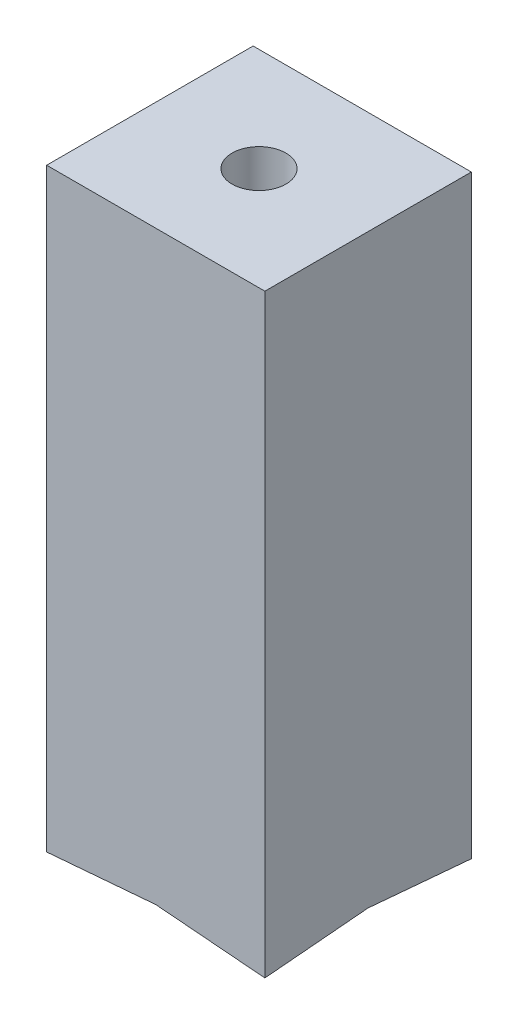
ISO-10303-21;
HEADER;
FILE_DESCRIPTION(('STEP AP214'),'2;1');
FILE_NAME('part.step','',(''),(''),'','','');
FILE_SCHEMA(('AUTOMOTIVE_DESIGN { 1 0 10303 214 1 1 1 1 }'));
ENDSEC;
DATA;
#1=APPLICATION_CONTEXT('core data for automotive mechanical design processes');
#2=APPLICATION_PROTOCOL_DEFINITION('international standard','automotive_design',2000,#1);
#3=PRODUCT_CONTEXT('',#1,'mechanical');
#4=PRODUCT('Part','Part','',(#3));
#5=PRODUCT_RELATED_PRODUCT_CATEGORY('part','',(#4));
#6=PRODUCT_DEFINITION_FORMATION('','',#4);
#7=PRODUCT_DEFINITION_CONTEXT('part definition',#1,'design');
#8=PRODUCT_DEFINITION('design','',#6,#7);
#9=PRODUCT_DEFINITION_SHAPE('','',#8);
#10=(LENGTH_UNIT() NAMED_UNIT(*) SI_UNIT(.MILLI.,.METRE.));
#11=(NAMED_UNIT(*) PLANE_ANGLE_UNIT() SI_UNIT($,.RADIAN.));
#12=(NAMED_UNIT(*) SI_UNIT($,.STERADIAN.) SOLID_ANGLE_UNIT());
#13=UNCERTAINTY_MEASURE_WITH_UNIT(LENGTH_MEASURE(1.E-05),#10,'distance_accuracy_value','');
#14=(GEOMETRIC_REPRESENTATION_CONTEXT(3) GLOBAL_UNCERTAINTY_ASSIGNED_CONTEXT((#13)) GLOBAL_UNIT_ASSIGNED_CONTEXT((#10,
#11,#12)) REPRESENTATION_CONTEXT('',''));
#15=CARTESIAN_POINT('',(0.,0.,0.));
#16=DIRECTION('',(0.,0.,1.));
#17=DIRECTION('',(1.,0.,0.));
#18=AXIS2_PLACEMENT_3D('',#15,#16,#17);
#19=CARTESIAN_POINT('',(-10.125,-55.2,9.58));
#20=DIRECTION('',(0.,0.996194698091746,0.0871557427476512));
#21=DIRECTION('',(0.,-0.0871557427476512,0.996194698091746));
#22=AXIS2_PLACEMENT_3D('',#19,#20,#21);
#23=PLANE('',#22);
#24=DIRECTION('',(1.,0.,0.));
#25=VECTOR('',#24,1.);
#26=CARTESIAN_POINT('',(-10.125,-54.3618586034217,0.));
#27=LINE('',#26,#25);
#28=CARTESIAN_POINT('',(-10.125,-54.3618586034217,0.));
#29=VERTEX_POINT('',#28);
#30=CARTESIAN_POINT('',(0.,-54.3618586034217,0.));
#31=VERTEX_POINT('',#30);
#32=EDGE_CURVE('E160',#29,#31,#27,.T.);
#33=ORIENTED_EDGE('',*,*,#32,.T.);
#34=DIRECTION('',(-0.725076524318788,-0.0600213976018447,0.686047713873974));
#35=VECTOR('',#34,1.);
#36=CARTESIAN_POINT('',(-10.125,-55.2,9.58));
#37=LINE('',#36,#35);
#38=CARTESIAN_POINT('',(-10.125,-55.2,9.58));
#39=VERTEX_POINT('',#38);
#40=EDGE_CURVE('E145',#31,#39,#37,.T.);
#41=ORIENTED_EDGE('',*,*,#40,.T.);
#42=DIRECTION('',(0.,-0.0871557427476512,0.996194698091746));
#43=VECTOR('',#42,1.);
#44=CARTESIAN_POINT('',(-10.125,-55.2,9.58));
#45=LINE('',#44,#43);
#46=EDGE_CURVE('E152',#29,#39,#45,.T.);
#47=ORIENTED_EDGE('',*,*,#46,.F.);
#48=EDGE_LOOP('',(#33,#41,#47));
#49=FACE_BOUND('',#48,.T.);
#50=ADVANCED_FACE('F51',(#49),#23,.F.);
#51=CARTESIAN_POINT('',(-10.125,-54.3618586034217,0.));
#52=DIRECTION('',(0.,0.996194698091746,-0.0871557427476512));
#53=DIRECTION('',(0.,0.0871557427476512,0.996194698091746));
#54=AXIS2_PLACEMENT_3D('',#51,#52,#53);
#55=PLANE('',#54);
#56=DIRECTION('',(0.,0.0871557427476512,0.996194698091746));
#57=VECTOR('',#56,1.);
#58=CARTESIAN_POINT('',(-10.125,-54.3618586034217,0.));
#59=LINE('',#58,#57);
#60=CARTESIAN_POINT('',(-10.125,-55.2,-9.58));
#61=VERTEX_POINT('',#60);
#62=EDGE_CURVE('E149',#61,#29,#59,.T.);
#63=ORIENTED_EDGE('',*,*,#62,.F.);
#64=DIRECTION('',(0.725076524318788,0.0600213976018447,0.686047713873974));
#65=VECTOR('',#64,1.);
#66=CARTESIAN_POINT('',(-5.32307665694692,-54.8024996802955,-5.03655055541249));
#67=LINE('',#66,#65);
#68=EDGE_CURVE('E11',#61,#31,#67,.T.);
#69=ORIENTED_EDGE('',*,*,#68,.T.);
#70=ORIENTED_EDGE('',*,*,#32,.F.);
#71=EDGE_LOOP('',(#63,#69,#70));
#72=FACE_BOUND('',#71,.T.);
#73=ADVANCED_FACE('F205',(#72),#55,.F.);
#74=CARTESIAN_POINT('',(10.125,-55.2,9.58));
#75=DIRECTION('',(1.,0.,0.));
#76=DIRECTION('',(0.,0.,-1.));
#77=AXIS2_PLACEMENT_3D('',#74,#75,#76);
#78=PLANE('',#77);
#79=DIRECTION('',(0.,-0.0871557427476512,0.996194698091746));
#80=VECTOR('',#79,1.);
#81=CARTESIAN_POINT('',(10.125,-55.2,9.58));
#82=LINE('',#81,#80);
#83=CARTESIAN_POINT('',(10.125,-54.3618586034217,0.));
#84=VERTEX_POINT('',#83);
#85=CARTESIAN_POINT('',(10.125,-55.2,9.58));
#86=VERTEX_POINT('',#85);
#87=EDGE_CURVE('E153',#84,#86,#82,.T.);
#88=ORIENTED_EDGE('',*,*,#87,.F.);
#89=DIRECTION('',(0.,0.0871557427476512,0.996194698091746));
#90=VECTOR('',#89,1.);
#91=CARTESIAN_POINT('',(10.125,-54.3618586034217,0.));
#92=LINE('',#91,#90);
#93=CARTESIAN_POINT('',(10.125,-55.2,-9.58));
#94=VERTEX_POINT('',#93);
#95=EDGE_CURVE('E148',#94,#84,#92,.T.);
#96=ORIENTED_EDGE('',*,*,#95,.F.);
#97=DIRECTION('',(0.,1.,0.));
#98=VECTOR('',#97,1.);
#99=CARTESIAN_POINT('',(10.125,-55.2,-9.58));
#100=LINE('',#99,#98);
#101=CARTESIAN_POINT('',(10.125,0.,-9.58));
#102=VERTEX_POINT('',#101);
#103=EDGE_CURVE('E174',#94,#102,#100,.T.);
#104=ORIENTED_EDGE('',*,*,#103,.T.);
#105=DIRECTION('',(0.,0.,-1.));
#106=VECTOR('',#105,1.);
#107=CARTESIAN_POINT('',(10.125,0.,9.58));
#108=LINE('',#107,#106);
#109=CARTESIAN_POINT('',(10.125,0.,9.58));
#110=VERTEX_POINT('',#109);
#111=EDGE_CURVE('E163',#110,#102,#108,.T.);
#112=ORIENTED_EDGE('',*,*,#111,.F.);
#113=DIRECTION('',(0.,1.,0.));
#114=VECTOR('',#113,1.);
#115=CARTESIAN_POINT('',(10.125,-55.2,9.58));
#116=LINE('',#115,#114);
#117=EDGE_CURVE('E66',#86,#110,#116,.T.);
#118=ORIENTED_EDGE('',*,*,#117,.F.);
#119=EDGE_LOOP('',(#88,#96,#104,#112,#118));
#120=FACE_BOUND('',#119,.T.);
#121=ADVANCED_FACE('F53',(#120),#78,.T.);
#122=CARTESIAN_POINT('',(-10.125,-55.2,9.58));
#123=DIRECTION('',(0.,0.,1.));
#124=DIRECTION('',(1.,0.,0.));
#125=AXIS2_PLACEMENT_3D('',#122,#123,#124);
#126=PLANE('',#125);
#127=DIRECTION('',(-0.996591294165675,-0.0824972265787436,0.));
#128=VECTOR('',#127,1.);
#129=CARTESIAN_POINT('',(-10.125,-55.2,9.58));
#130=LINE('',#129,#128);
#131=CARTESIAN_POINT('',(0.,-54.3618586034217,9.58));
#132=VERTEX_POINT('',#131);
#133=EDGE_CURVE('E126',#132,#39,#130,.T.);
#134=ORIENTED_EDGE('',*,*,#133,.F.);
#135=DIRECTION('',(-0.996591294165675,0.0824972265787436,0.));
#136=VECTOR('',#135,1.);
#137=CARTESIAN_POINT('',(0.,-54.3618586034217,9.58));
#138=LINE('',#137,#136);
#139=EDGE_CURVE('E122',#86,#132,#138,.T.);
#140=ORIENTED_EDGE('',*,*,#139,.F.);
#141=ORIENTED_EDGE('',*,*,#117,.T.);
#142=DIRECTION('',(1.,0.,0.));
#143=VECTOR('',#142,1.);
#144=CARTESIAN_POINT('',(-10.125,0.,9.58));
#145=LINE('',#144,#143);
#146=CARTESIAN_POINT('',(-10.125,0.,9.58));
#147=VERTEX_POINT('',#146);
#148=EDGE_CURVE('E171',#147,#110,#145,.T.);
#149=ORIENTED_EDGE('',*,*,#148,.F.);
#150=DIRECTION('',(0.,1.,0.));
#151=VECTOR('',#150,1.);
#152=CARTESIAN_POINT('',(-10.125,-55.2,9.58));
#153=LINE('',#152,#151);
#154=EDGE_CURVE('E74',#39,#147,#153,.T.);
#155=ORIENTED_EDGE('',*,*,#154,.F.);
#156=EDGE_LOOP('',(#134,#140,#141,#149,#155));
#157=FACE_BOUND('',#156,.T.);
#158=ADVANCED_FACE('F196',(#157),#126,.T.);
#159=CARTESIAN_POINT('',(-10.125,-55.2,9.58));
#160=DIRECTION('',(-1.,0.,0.));
#161=DIRECTION('',(0.,0.,1.));
#162=AXIS2_PLACEMENT_3D('',#159,#160,#161);
#163=PLANE('',#162);
#164=ORIENTED_EDGE('',*,*,#46,.T.);
#165=ORIENTED_EDGE('',*,*,#154,.T.);
#166=DIRECTION('',(0.,0.,1.));
#167=VECTOR('',#166,1.);
#168=CARTESIAN_POINT('',(-10.125,0.,9.58));
#169=LINE('',#168,#167);
#170=CARTESIAN_POINT('',(-10.125,0.,-9.58));
#171=VERTEX_POINT('',#170);
#172=EDGE_CURVE('E169',#171,#147,#169,.T.);
#173=ORIENTED_EDGE('',*,*,#172,.F.);
#174=DIRECTION('',(0.,1.,0.));
#175=VECTOR('',#174,1.);
#176=CARTESIAN_POINT('',(-10.125,-55.2,-9.58));
#177=LINE('',#176,#175);
#178=EDGE_CURVE('E177',#61,#171,#177,.T.);
#179=ORIENTED_EDGE('',*,*,#178,.F.);
#180=ORIENTED_EDGE('',*,*,#62,.T.);
#181=EDGE_LOOP('',(#164,#165,#173,#179,#180));
#182=FACE_BOUND('',#181,.T.);
#183=ADVANCED_FACE('F202',(#182),#163,.T.);
#184=CARTESIAN_POINT('',(-10.125,-55.2,-9.58));
#185=DIRECTION('',(0.,0.,-1.));
#186=DIRECTION('',(-1.,0.,0.));
#187=AXIS2_PLACEMENT_3D('',#184,#185,#186);
#188=PLANE('',#187);
#189=DIRECTION('',(-0.996591294165675,-0.0824972265787436,0.));
#190=VECTOR('',#189,1.);
#191=CARTESIAN_POINT('',(-10.125,-55.2,-9.58));
#192=LINE('',#191,#190);
#193=CARTESIAN_POINT('',(0.,-54.3618586034217,-9.58));
#194=VERTEX_POINT('',#193);
#195=EDGE_CURVE('E134',#194,#61,#192,.T.);
#196=ORIENTED_EDGE('',*,*,#195,.T.);
#197=ORIENTED_EDGE('',*,*,#178,.T.);
#198=DIRECTION('',(-1.,0.,0.));
#199=VECTOR('',#198,1.);
#200=CARTESIAN_POINT('',(-10.125,0.,-9.58));
#201=LINE('',#200,#199);
#202=EDGE_CURVE('E166',#102,#171,#201,.T.);
#203=ORIENTED_EDGE('',*,*,#202,.F.);
#204=ORIENTED_EDGE('',*,*,#103,.F.);
#205=DIRECTION('',(-0.996591294165675,0.0824972265787436,0.));
#206=VECTOR('',#205,1.);
#207=CARTESIAN_POINT('',(0.,-54.3618586034217,-9.58));
#208=LINE('',#207,#206);
#209=EDGE_CURVE('E131',#94,#194,#208,.T.);
#210=ORIENTED_EDGE('',*,*,#209,.T.);
#211=EDGE_LOOP('',(#196,#197,#203,#204,#210));
#212=FACE_BOUND('',#211,.T.);
#213=ADVANCED_FACE('F191',(#212),#188,.T.);
#214=CARTESIAN_POINT('',(0.,0.,0.));
#215=DIRECTION('',(0.,-1.,0.));
#216=DIRECTION('',(0.,0.,-1.));
#217=AXIS2_PLACEMENT_3D('',#214,#215,#216);
#218=PLANE('',#217);
#219=CARTESIAN_POINT('',(0.,0.,0.));
#220=DIRECTION('',(0.,1.,0.));
#221=DIRECTION('',(0.,0.,1.));
#222=AXIS2_PLACEMENT_3D('',#219,#220,#221);
#223=CIRCLE('',#222,2.49999999999999);
#224=CARTESIAN_POINT('',(0.,0.,2.49999999999999));
#225=VERTEX_POINT('',#224);
#226=EDGE_CURVE('E123',#225,#225,#223,.T.);
#227=ORIENTED_EDGE('',*,*,#226,.F.);
#228=EDGE_LOOP('',(#227));
#229=FACE_BOUND('',#228,.T.);
#230=ORIENTED_EDGE('',*,*,#111,.T.);
#231=ORIENTED_EDGE('',*,*,#202,.T.);
#232=ORIENTED_EDGE('',*,*,#172,.T.);
#233=ORIENTED_EDGE('',*,*,#148,.T.);
#234=EDGE_LOOP('',(#230,#231,#232,#233));
#235=FACE_BOUND('',#234,.T.);
#236=ADVANCED_FACE('F194',(#229,#235),#218,.F.);
#237=ORIENTED_EDGE('',*,*,#87,.T.);
#238=DIRECTION('',(-0.725076524318788,0.0600213976018447,-0.686047713873974));
#239=VECTOR('',#238,1.);
#240=CARTESIAN_POINT('',(-0.521153313893845,-54.3187178462525,-0.493101110824989));
#241=LINE('',#240,#239);
#242=EDGE_CURVE('E142',#86,#31,#241,.T.);
#243=ORIENTED_EDGE('',*,*,#242,.T.);
#244=EDGE_CURVE('E155',#31,#84,#27,.T.);
#245=ORIENTED_EDGE('',*,*,#244,.T.);
#246=EDGE_LOOP('',(#237,#243,#245));
#247=FACE_BOUND('',#246,.T.);
#248=ADVANCED_FACE('F210',(#247),#23,.F.);
#249=ORIENTED_EDGE('',*,*,#244,.F.);
#250=DIRECTION('',(0.725076524318788,-0.0600213976018447,-0.686047713873974));
#251=VECTOR('',#250,1.);
#252=CARTESIAN_POINT('',(-5.32307665694692,-53.921217526548,5.03655055541249));
#253=LINE('',#252,#251);
#254=EDGE_CURVE('E59',#31,#94,#253,.T.);
#255=ORIENTED_EDGE('',*,*,#254,.T.);
#256=ORIENTED_EDGE('',*,*,#95,.T.);
#257=EDGE_LOOP('',(#249,#255,#256));
#258=FACE_BOUND('',#257,.T.);
#259=ADVANCED_FACE('F184',(#258),#55,.F.);
#260=CARTESIAN_POINT('',(0.,-54.3618586034217,-9.58));
#261=DIRECTION('',(0.0824972265787436,0.996591294165675,0.));
#262=DIRECTION('',(-0.996591294165675,0.0824972265787436,0.));
#263=AXIS2_PLACEMENT_3D('',#260,#261,#262);
#264=PLANE('',#263);
#265=DIRECTION('',(0.,0.,1.));
#266=VECTOR('',#265,1.);
#267=CARTESIAN_POINT('',(0.,-54.3618586034217,-9.58));
#268=LINE('',#267,#266);
#269=EDGE_CURVE('E139',#194,#31,#268,.T.);
#270=ORIENTED_EDGE('',*,*,#269,.F.);
#271=ORIENTED_EDGE('',*,*,#209,.F.);
#272=ORIENTED_EDGE('',*,*,#254,.F.);
#273=EDGE_LOOP('',(#270,#271,#272));
#274=FACE_BOUND('',#273,.T.);
#275=ADVANCED_FACE('F214',(#274),#264,.F.);
#276=CARTESIAN_POINT('',(-10.125,-55.2,-9.58));
#277=DIRECTION('',(-0.0824972265787436,0.996591294165675,0.));
#278=DIRECTION('',(-0.996591294165675,-0.0824972265787436,0.));
#279=AXIS2_PLACEMENT_3D('',#276,#277,#278);
#280=PLANE('',#279);
#281=ORIENTED_EDGE('',*,*,#195,.F.);
#282=ORIENTED_EDGE('',*,*,#269,.T.);
#283=ORIENTED_EDGE('',*,*,#68,.F.);
#284=EDGE_LOOP('',(#281,#282,#283));
#285=FACE_BOUND('',#284,.T.);
#286=ADVANCED_FACE('F208',(#285),#280,.F.);
#287=EDGE_CURVE('E136',#31,#132,#268,.T.);
#288=ORIENTED_EDGE('',*,*,#287,.T.);
#289=ORIENTED_EDGE('',*,*,#133,.T.);
#290=ORIENTED_EDGE('',*,*,#40,.F.);
#291=EDGE_LOOP('',(#288,#289,#290));
#292=FACE_BOUND('',#291,.T.);
#293=ADVANCED_FACE('F199',(#292),#280,.F.);
#294=ORIENTED_EDGE('',*,*,#139,.T.);
#295=ORIENTED_EDGE('',*,*,#287,.F.);
#296=ORIENTED_EDGE('',*,*,#242,.F.);
#297=EDGE_LOOP('',(#294,#295,#296));
#298=FACE_BOUND('',#297,.T.);
#299=ADVANCED_FACE('F116',(#298),#264,.F.);
#300=CARTESIAN_POINT('',(0.,-15.,0.));
#301=DIRECTION('',(0.,1.,0.));
#302=DIRECTION('',(0.,0.,1.));
#303=AXIS2_PLACEMENT_3D('',#300,#301,#302);
#304=CONICAL_SURFACE('',#303,2.49999999999999,1.02974425867665);
#305=CARTESIAN_POINT('',(0.,-16.5021515475689,0.));
#306=VERTEX_POINT('',#305);
#307=VERTEX_LOOP('',#306);
#308=FACE_BOUND('',#307,.T.);
#309=CARTESIAN_POINT('',(0.,-15.,0.));
#310=DIRECTION('',(0.,1.,0.));
#311=DIRECTION('',(0.,0.,1.));
#312=AXIS2_PLACEMENT_3D('',#309,#310,#311);
#313=CIRCLE('',#312,2.49999999999999);
#314=CARTESIAN_POINT('',(0.,-15.,2.49999999999999));
#315=VERTEX_POINT('',#314);
#316=EDGE_CURVE('E120',#315,#315,#313,.T.);
#317=ORIENTED_EDGE('',*,*,#316,.T.);
#318=EDGE_LOOP('',(#317));
#319=FACE_BOUND('',#318,.T.);
#320=ADVANCED_FACE('F112',(#308,#319),#304,.F.);
#321=CARTESIAN_POINT('',(0.,0.,0.));
#322=DIRECTION('',(0.,1.,0.));
#323=DIRECTION('',(0.,0.,1.));
#324=AXIS2_PLACEMENT_3D('',#321,#322,#323);
#325=CYLINDRICAL_SURFACE('',#324,2.49999999999999);
#326=ORIENTED_EDGE('',*,*,#316,.F.);
#327=EDGE_LOOP('',(#326));
#328=FACE_BOUND('',#327,.T.);
#329=ORIENTED_EDGE('',*,*,#226,.T.);
#330=EDGE_LOOP('',(#329));
#331=FACE_BOUND('',#330,.T.);
#332=ADVANCED_FACE('F115',(#328,#331),#325,.F.);
#333=CLOSED_SHELL('',(#50,#73,#121,#158,#183,#213,#236,#248,#259,#275,#286,#293,#299,#320,#332));
#334=MANIFOLD_SOLID_BREP('B2',#333);
#335=ADVANCED_BREP_SHAPE_REPRESENTATION('',(#18,#334),#14);
#336=SHAPE_DEFINITION_REPRESENTATION(#9,#335);
ENDSEC;
END-ISO-10303-21;
